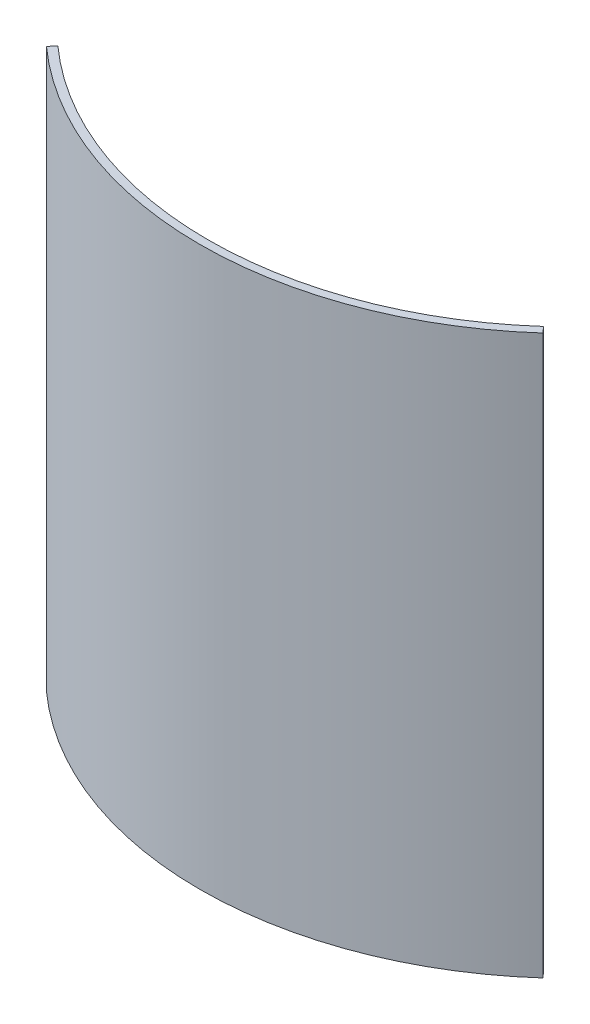
ISO-10303-21;
HEADER;
FILE_DESCRIPTION(('STEP AP214'),'2;1');
FILE_NAME('part.step','',(''),(''),'','','');
FILE_SCHEMA(('AUTOMOTIVE_DESIGN { 1 0 10303 214 1 1 1 1 }'));
ENDSEC;
DATA;
#1=APPLICATION_CONTEXT('core data for automotive mechanical design processes');
#2=APPLICATION_PROTOCOL_DEFINITION('international standard','automotive_design',2000,#1);
#3=PRODUCT_CONTEXT('',#1,'mechanical');
#4=PRODUCT('Part','Part','',(#3));
#5=PRODUCT_RELATED_PRODUCT_CATEGORY('part','',(#4));
#6=PRODUCT_DEFINITION_FORMATION('','',#4);
#7=PRODUCT_DEFINITION_CONTEXT('part definition',#1,'design');
#8=PRODUCT_DEFINITION('design','',#6,#7);
#9=PRODUCT_DEFINITION_SHAPE('','',#8);
#10=(LENGTH_UNIT() NAMED_UNIT(*) SI_UNIT(.MILLI.,.METRE.));
#11=(NAMED_UNIT(*) PLANE_ANGLE_UNIT() SI_UNIT($,.RADIAN.));
#12=(NAMED_UNIT(*) SI_UNIT($,.STERADIAN.) SOLID_ANGLE_UNIT());
#13=UNCERTAINTY_MEASURE_WITH_UNIT(LENGTH_MEASURE(1.E-05),#10,'distance_accuracy_value','');
#14=(GEOMETRIC_REPRESENTATION_CONTEXT(3) GLOBAL_UNCERTAINTY_ASSIGNED_CONTEXT((#13)) GLOBAL_UNIT_ASSIGNED_CONTEXT((#10,
#11,#12)) REPRESENTATION_CONTEXT('',''));
#15=CARTESIAN_POINT('',(0.,0.,0.));
#16=DIRECTION('',(0.,0.,1.));
#17=DIRECTION('',(1.,0.,0.));
#18=AXIS2_PLACEMENT_3D('',#15,#16,#17);
#19=CARTESIAN_POINT('',(1.59204083889156E-13,-1300.,0.));
#20=DIRECTION('',(0.,1.,0.));
#21=DIRECTION('',(-1.,0.,0.));
#22=AXIS2_PLACEMENT_3D('',#19,#20,#21);
#23=PLANE('',#22);
#24=CARTESIAN_POINT('',(1.59204083889156E-13,-1300.,0.));
#25=DIRECTION('',(0.,1.,0.));
#26=DIRECTION('',(-1.,0.,0.));
#27=AXIS2_PLACEMENT_3D('',#24,#25,#26);
#28=CIRCLE('',#27,450.);
#29=CARTESIAN_POINT('',(-300.,-1300.,335.410196624968));
#30=VERTEX_POINT('',#29);
#31=CARTESIAN_POINT('',(300.,-1300.,335.410196624968));
#32=VERTEX_POINT('',#31);
#33=EDGE_CURVE('E81',#30,#32,#28,.T.);
#34=ORIENTED_EDGE('',*,*,#33,.T.);
#35=DIRECTION('',(-0.666666666666666,0.,-0.745355992499931));
#36=VECTOR('',#35,1.);
#37=CARTESIAN_POINT('',(6.14335345317823E-13,-1300.,-4.0708177569589E-13));
#38=LINE('',#37,#36);
#39=CARTESIAN_POINT('',(306.666666666667,-1300.,342.863756549968));
#40=VERTEX_POINT('',#39);
#41=EDGE_CURVE('E87',#40,#32,#38,.T.);
#42=ORIENTED_EDGE('',*,*,#41,.F.);
#43=CARTESIAN_POINT('',(1.59204083889156E-13,-1300.,0.));
#44=DIRECTION('',(0.,1.,0.));
#45=DIRECTION('',(-1.,0.,0.));
#46=AXIS2_PLACEMENT_3D('',#43,#44,#45);
#47=CIRCLE('',#46,460.);
#48=CARTESIAN_POINT('',(-306.666666666666,-1300.,342.863756549968));
#49=VERTEX_POINT('',#48);
#50=EDGE_CURVE('E93',#49,#40,#47,.T.);
#51=ORIENTED_EDGE('',*,*,#50,.F.);
#52=DIRECTION('',(-0.666666666666666,0.,0.745355992499931));
#53=VECTOR('',#52,1.);
#54=CARTESIAN_POINT('',(-2.13176039097935E-13,-1300.,-3.33066907387547E-13));
#55=LINE('',#54,#53);
#56=EDGE_CURVE('E85',#30,#49,#55,.T.);
#57=ORIENTED_EDGE('',*,*,#56,.F.);
#58=EDGE_LOOP('',(#34,#42,#51,#57));
#59=FACE_BOUND('',#58,.T.);
#60=ADVANCED_FACE('F39',(#59),#23,.F.);
#61=CARTESIAN_POINT('',(4.40942537144217E-13,115.85972620293,-4.0708177569589E-13));
#62=DIRECTION('',(-0.745355992499931,0.,0.666666666666666));
#63=DIRECTION('',(0.666666666666666,0.,0.745355992499931));
#64=AXIS2_PLACEMENT_3D('',#61,#62,#63);
#65=PLANE('',#64);
#66=DIRECTION('',(0.,-1.,0.));
#67=VECTOR('',#66,1.);
#68=CARTESIAN_POINT('',(300.,115.85972620293,335.410196624968));
#69=LINE('',#68,#67);
#70=CARTESIAN_POINT('',(300.,-610.,335.410196624968));
#71=VERTEX_POINT('',#70);
#72=EDGE_CURVE('E78',#71,#32,#69,.T.);
#73=ORIENTED_EDGE('',*,*,#72,.F.);
#74=DIRECTION('',(0.666666666666666,0.,0.745355992499931));
#75=VECTOR('',#74,1.);
#76=CARTESIAN_POINT('',(5.20173976631816E-13,-610.,-4.17882810863481E-13));
#77=LINE('',#76,#75);
#78=CARTESIAN_POINT('',(306.666666666667,-610.,342.863756549968));
#79=VERTEX_POINT('',#78);
#80=EDGE_CURVE('E43',#71,#79,#77,.T.);
#81=ORIENTED_EDGE('',*,*,#80,.T.);
#82=DIRECTION('',(0.,-1.,0.));
#83=VECTOR('',#82,1.);
#84=CARTESIAN_POINT('',(306.666666666667,115.85972620293,342.863756549968));
#85=LINE('',#84,#83);
#86=EDGE_CURVE('E84',#79,#40,#85,.T.);
#87=ORIENTED_EDGE('',*,*,#86,.T.);
#88=ORIENTED_EDGE('',*,*,#41,.T.);
#89=EDGE_LOOP('',(#73,#81,#87,#88));
#90=FACE_BOUND('',#89,.T.);
#91=ADVANCED_FACE('F88',(#90),#65,.F.);
#92=CARTESIAN_POINT('',(0.,115.85972620293,0.));
#93=DIRECTION('',(0.,-1.,0.));
#94=DIRECTION('',(1.,0.,0.));
#95=AXIS2_PLACEMENT_3D('',#92,#93,#94);
#96=CYLINDRICAL_SURFACE('',#95,460.);
#97=ORIENTED_EDGE('',*,*,#86,.F.);
#98=CARTESIAN_POINT('',(0.,-610.,0.));
#99=DIRECTION('',(0.,-1.,0.));
#100=DIRECTION('',(1.,0.,0.));
#101=AXIS2_PLACEMENT_3D('',#98,#99,#100);
#102=CIRCLE('',#101,460.);
#103=CARTESIAN_POINT('',(-306.666666666667,-610.,342.863756549968));
#104=VERTEX_POINT('',#103);
#105=EDGE_CURVE('E109',#79,#104,#102,.T.);
#106=ORIENTED_EDGE('',*,*,#105,.T.);
#107=DIRECTION('',(0.,-1.,0.));
#108=VECTOR('',#107,1.);
#109=CARTESIAN_POINT('',(-306.666666666667,115.85972620293,342.863756549968));
#110=LINE('',#109,#108);
#111=EDGE_CURVE('E104',#104,#49,#110,.T.);
#112=ORIENTED_EDGE('',*,*,#111,.T.);
#113=ORIENTED_EDGE('',*,*,#50,.T.);
#114=EDGE_LOOP('',(#97,#106,#112,#113));
#115=FACE_BOUND('',#114,.T.);
#116=ADVANCED_FACE('F108',(#115),#96,.T.);
#117=CARTESIAN_POINT('',(-3.86568847271542E-13,115.85972620293,-3.33066907387547E-13));
#118=DIRECTION('',(0.745355992499931,0.,0.666666666666666));
#119=DIRECTION('',(0.666666666666666,0.,-0.745355992499931));
#120=AXIS2_PLACEMENT_3D('',#117,#118,#119);
#121=PLANE('',#120);
#122=ORIENTED_EDGE('',*,*,#111,.F.);
#123=DIRECTION('',(0.666666666666666,0.,-0.745355992499931));
#124=VECTOR('',#123,1.);
#125=CARTESIAN_POINT('',(-3.07337407783942E-13,-610.,-3.22265872219956E-13));
#126=LINE('',#125,#124);
#127=CARTESIAN_POINT('',(-300.,-610.,335.410196624968));
#128=VERTEX_POINT('',#127);
#129=EDGE_CURVE('E48',#104,#128,#126,.T.);
#130=ORIENTED_EDGE('',*,*,#129,.T.);
#131=DIRECTION('',(0.,-1.,0.));
#132=VECTOR('',#131,1.);
#133=CARTESIAN_POINT('',(-300.,115.85972620293,335.410196624968));
#134=LINE('',#133,#132);
#135=EDGE_CURVE('E102',#128,#30,#134,.T.);
#136=ORIENTED_EDGE('',*,*,#135,.T.);
#137=ORIENTED_EDGE('',*,*,#56,.T.);
#138=EDGE_LOOP('',(#122,#130,#136,#137));
#139=FACE_BOUND('',#138,.T.);
#140=ADVANCED_FACE('F111',(#139),#121,.F.);
#141=CARTESIAN_POINT('',(0.,115.85972620293,0.));
#142=DIRECTION('',(0.,-1.,0.));
#143=DIRECTION('',(1.,0.,0.));
#144=AXIS2_PLACEMENT_3D('',#141,#142,#143);
#145=CYLINDRICAL_SURFACE('',#144,450.);
#146=CARTESIAN_POINT('',(0.,-610.,0.));
#147=DIRECTION('',(0.,-1.,0.));
#148=DIRECTION('',(1.,0.,0.));
#149=AXIS2_PLACEMENT_3D('',#146,#147,#148);
#150=CIRCLE('',#149,450.);
#151=EDGE_CURVE('E11',#71,#128,#150,.T.);
#152=ORIENTED_EDGE('',*,*,#151,.F.);
#153=ORIENTED_EDGE('',*,*,#72,.T.);
#154=ORIENTED_EDGE('',*,*,#33,.F.);
#155=ORIENTED_EDGE('',*,*,#135,.F.);
#156=EDGE_LOOP('',(#152,#153,#154,#155));
#157=FACE_BOUND('',#156,.T.);
#158=ADVANCED_FACE('F41',(#157),#145,.F.);
#159=CARTESIAN_POINT('',(0.,-610.,0.));
#160=DIRECTION('',(0.,-1.,0.));
#161=DIRECTION('',(1.,0.,0.));
#162=AXIS2_PLACEMENT_3D('',#159,#160,#161);
#163=PLANE('',#162);
#164=ORIENTED_EDGE('',*,*,#151,.T.);
#165=ORIENTED_EDGE('',*,*,#129,.F.);
#166=ORIENTED_EDGE('',*,*,#105,.F.);
#167=ORIENTED_EDGE('',*,*,#80,.F.);
#168=EDGE_LOOP('',(#164,#165,#166,#167));
#169=FACE_BOUND('',#168,.T.);
#170=ADVANCED_FACE('F113',(#169),#163,.F.);
#171=CLOSED_SHELL('',(#60,#91,#116,#140,#158,#170));
#172=MANIFOLD_SOLID_BREP('B2',#171);
#173=ADVANCED_BREP_SHAPE_REPRESENTATION('',(#18,#172),#14);
#174=SHAPE_DEFINITION_REPRESENTATION(#9,#173);
ENDSEC;
END-ISO-10303-21;
